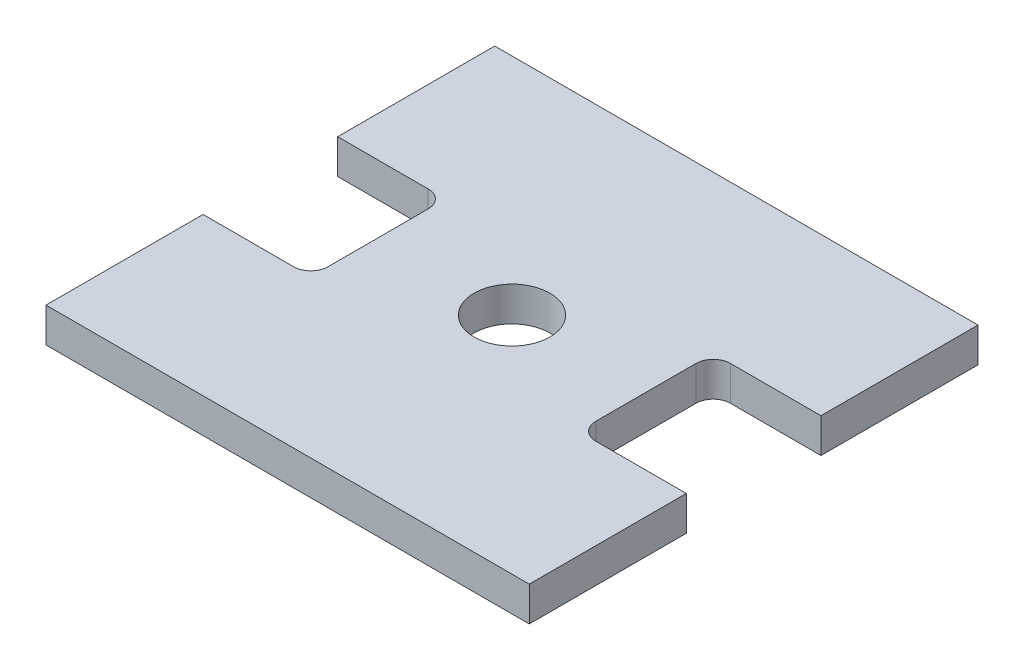
ISO-10303-21;
HEADER;
FILE_DESCRIPTION(('STEP AP214'),'2;1');
FILE_NAME('part.step','',(''),(''),'','','');
FILE_SCHEMA(('AUTOMOTIVE_DESIGN { 1 0 10303 214 1 1 1 1 }'));
ENDSEC;
DATA;
#1=APPLICATION_CONTEXT('core data for automotive mechanical design processes');
#2=APPLICATION_PROTOCOL_DEFINITION('international standard','automotive_design',2000,#1);
#3=PRODUCT_CONTEXT('',#1,'mechanical');
#4=PRODUCT('Part','Part','',(#3));
#5=PRODUCT_RELATED_PRODUCT_CATEGORY('part','',(#4));
#6=PRODUCT_DEFINITION_FORMATION('','',#4);
#7=PRODUCT_DEFINITION_CONTEXT('part definition',#1,'design');
#8=PRODUCT_DEFINITION('design','',#6,#7);
#9=PRODUCT_DEFINITION_SHAPE('','',#8);
#10=(LENGTH_UNIT() NAMED_UNIT(*) SI_UNIT(.MILLI.,.METRE.));
#11=(NAMED_UNIT(*) PLANE_ANGLE_UNIT() SI_UNIT($,.RADIAN.));
#12=(NAMED_UNIT(*) SI_UNIT($,.STERADIAN.) SOLID_ANGLE_UNIT());
#13=UNCERTAINTY_MEASURE_WITH_UNIT(LENGTH_MEASURE(1.E-05),#10,'distance_accuracy_value','');
#14=(GEOMETRIC_REPRESENTATION_CONTEXT(3) GLOBAL_UNCERTAINTY_ASSIGNED_CONTEXT((#13)) GLOBAL_UNIT_ASSIGNED_CONTEXT((#10,
#11,#12)) REPRESENTATION_CONTEXT('',''));
#15=CARTESIAN_POINT('',(0.,0.,0.));
#16=DIRECTION('',(0.,0.,1.));
#17=DIRECTION('',(1.,0.,0.));
#18=AXIS2_PLACEMENT_3D('',#15,#16,#17);
#19=CARTESIAN_POINT('',(-7.95386724772259,10.,2.43785422568007));
#20=DIRECTION('',(0.,1.,0.));
#21=DIRECTION('',(0.,0.,1.));
#22=AXIS2_PLACEMENT_3D('',#19,#20,#21);
#23=PLANE('',#22);
#24=DIRECTION('',(0.,0.,1.));
#25=VECTOR('',#24,1.);
#26=CARTESIAN_POINT('',(-34.1762724658674,10.,-48.0573759783204));
#27=LINE('',#26,#25);
#28=CARTESIAN_POINT('',(-34.1762724658674,10.,-48.0573759783204));
#29=VERTEX_POINT('',#28);
#30=CARTESIAN_POINT('',(-34.1762724658674,10.,-2.56214577431994));
#31=VERTEX_POINT('',#30);
#32=EDGE_CURVE('E208',#29,#31,#27,.T.);
#33=ORIENTED_EDGE('',*,*,#32,.T.);
#34=DIRECTION('',(1.,0.,0.));
#35=VECTOR('',#34,1.);
#36=CARTESIAN_POINT('',(-34.1762724658674,10.,-2.56214577431994));
#37=LINE('',#36,#35);
#38=CARTESIAN_POINT('',(-7.95386724772259,10.,-2.56214577431993));
#39=VERTEX_POINT('',#38);
#40=EDGE_CURVE('E116',#31,#39,#37,.T.);
#41=ORIENTED_EDGE('',*,*,#40,.T.);
#42=CARTESIAN_POINT('',(-7.95386724772259,10.,2.43785422568007));
#43=DIRECTION('',(0.,-1.,0.));
#44=DIRECTION('',(0.,0.,1.));
#45=AXIS2_PLACEMENT_3D('',#42,#43,#44);
#46=CIRCLE('',#45,5.);
#47=CARTESIAN_POINT('',(-2.95386724772259,10.,2.43785422568007));
#48=VERTEX_POINT('',#47);
#49=EDGE_CURVE('E247',#39,#48,#46,.T.);
#50=ORIENTED_EDGE('',*,*,#49,.T.);
#51=DIRECTION('',(0.,0.,1.));
#52=VECTOR('',#51,1.);
#53=CARTESIAN_POINT('',(-2.95386724772259,10.,2.43785422568007));
#54=LINE('',#53,#52);
#55=CARTESIAN_POINT('',(-2.95386724772259,10.,31.4473938176792));
#56=VERTEX_POINT('',#55);
#57=EDGE_CURVE('E266',#48,#56,#54,.T.);
#58=ORIENTED_EDGE('',*,*,#57,.T.);
#59=CARTESIAN_POINT('',(-7.95386724772259,10.,31.4473938176792));
#60=DIRECTION('',(0.,-1.,0.));
#61=DIRECTION('',(0.,0.,1.));
#62=AXIS2_PLACEMENT_3D('',#59,#60,#61);
#63=CIRCLE('',#62,5.);
#64=CARTESIAN_POINT('',(-7.95386724772259,10.,36.4473938176792));
#65=VERTEX_POINT('',#64);
#66=EDGE_CURVE('E263',#56,#65,#63,.T.);
#67=ORIENTED_EDGE('',*,*,#66,.T.);
#68=DIRECTION('',(-1.,0.,0.));
#69=VECTOR('',#68,1.);
#70=CARTESIAN_POINT('',(-34.1762724658674,10.,36.4473938176792));
#71=LINE('',#70,#69);
#72=CARTESIAN_POINT('',(-34.1762724658674,10.,36.4473938176792));
#73=VERTEX_POINT('',#72);
#74=EDGE_CURVE('E265',#65,#73,#71,.T.);
#75=ORIENTED_EDGE('',*,*,#74,.T.);
#76=DIRECTION('',(0.,0.,1.));
#77=VECTOR('',#76,1.);
#78=CARTESIAN_POINT('',(-34.1762724658674,10.,36.4473938176792));
#79=LINE('',#78,#77);
#80=CARTESIAN_POINT('',(-34.1762724658675,10.,81.9426240216796));
#81=VERTEX_POINT('',#80);
#82=EDGE_CURVE('E268',#73,#81,#79,.T.);
#83=ORIENTED_EDGE('',*,*,#82,.T.);
#84=DIRECTION('',(1.,0.,0.));
#85=VECTOR('',#84,1.);
#86=CARTESIAN_POINT('',(-34.1762724658675,10.,81.9426240216796));
#87=LINE('',#86,#85);
#88=CARTESIAN_POINT('',(105.823727534133,10.,81.9426240216796));
#89=VERTEX_POINT('',#88);
#90=EDGE_CURVE('E274',#81,#89,#87,.T.);
#91=ORIENTED_EDGE('',*,*,#90,.T.);
#92=DIRECTION('',(0.,0.,-1.));
#93=VECTOR('',#92,1.);
#94=CARTESIAN_POINT('',(105.823727534133,10.,36.4473938176792));
#95=LINE('',#94,#93);
#96=CARTESIAN_POINT('',(105.823727534133,10.,36.4473938176792));
#97=VERTEX_POINT('',#96);
#98=EDGE_CURVE('E276',#89,#97,#95,.T.);
#99=ORIENTED_EDGE('',*,*,#98,.T.);
#100=DIRECTION('',(-1.,0.,0.));
#101=VECTOR('',#100,1.);
#102=CARTESIAN_POINT('',(105.823727534133,10.,36.4473938176792));
#103=LINE('',#102,#101);
#104=CARTESIAN_POINT('',(79.6013223159877,10.,36.4473938176792));
#105=VERTEX_POINT('',#104);
#106=EDGE_CURVE('E278',#97,#105,#103,.T.);
#107=ORIENTED_EDGE('',*,*,#106,.T.);
#108=CARTESIAN_POINT('',(79.6013223159877,10.,31.4473938176792));
#109=DIRECTION('',(0.,-1.,0.));
#110=DIRECTION('',(0.,0.,-1.));
#111=AXIS2_PLACEMENT_3D('',#108,#109,#110);
#112=CIRCLE('',#111,5.);
#113=CARTESIAN_POINT('',(74.6013223159877,10.,31.4473938176792));
#114=VERTEX_POINT('',#113);
#115=EDGE_CURVE('E280',#105,#114,#112,.T.);
#116=ORIENTED_EDGE('',*,*,#115,.T.);
#117=DIRECTION('',(0.,0.,-1.));
#118=VECTOR('',#117,1.);
#119=CARTESIAN_POINT('',(74.6013223159877,10.,2.43785422568007));
#120=LINE('',#119,#118);
#121=CARTESIAN_POINT('',(74.6013223159877,10.,2.43785422568007));
#122=VERTEX_POINT('',#121);
#123=EDGE_CURVE('E282',#114,#122,#120,.T.);
#124=ORIENTED_EDGE('',*,*,#123,.T.);
#125=CARTESIAN_POINT('',(79.6013223159877,10.,2.43785422568007));
#126=DIRECTION('',(0.,-1.,0.));
#127=DIRECTION('',(0.,0.,-1.));
#128=AXIS2_PLACEMENT_3D('',#125,#126,#127);
#129=CIRCLE('',#128,5.);
#130=CARTESIAN_POINT('',(79.6013223159877,10.,-2.56214577431993));
#131=VERTEX_POINT('',#130);
#132=EDGE_CURVE('E159',#122,#131,#129,.T.);
#133=ORIENTED_EDGE('',*,*,#132,.T.);
#134=DIRECTION('',(1.,0.,0.));
#135=VECTOR('',#134,1.);
#136=CARTESIAN_POINT('',(105.823727534133,10.,-2.56214577431994));
#137=LINE('',#136,#135);
#138=CARTESIAN_POINT('',(105.823727534133,10.,-2.56214577431994));
#139=VERTEX_POINT('',#138);
#140=EDGE_CURVE('E153',#131,#139,#137,.T.);
#141=ORIENTED_EDGE('',*,*,#140,.T.);
#142=DIRECTION('',(0.,0.,-1.));
#143=VECTOR('',#142,1.);
#144=CARTESIAN_POINT('',(105.823727534133,10.,-48.0573759783204));
#145=LINE('',#144,#143);
#146=CARTESIAN_POINT('',(105.823727534133,10.,-48.0573759783204));
#147=VERTEX_POINT('',#146);
#148=EDGE_CURVE('E157',#139,#147,#145,.T.);
#149=ORIENTED_EDGE('',*,*,#148,.T.);
#150=DIRECTION('',(-1.,0.,0.));
#151=VECTOR('',#150,1.);
#152=CARTESIAN_POINT('',(-34.1762724658674,10.,-48.0573759783204));
#153=LINE('',#152,#151);
#154=EDGE_CURVE('E49',#147,#29,#153,.T.);
#155=ORIENTED_EDGE('',*,*,#154,.T.);
#156=EDGE_LOOP('',(#33,#41,#50,#58,#67,#75,#83,#91,#99,#107,#116,#124,#133,#141,#149,#155));
#157=FACE_BOUND('',#156,.T.);
#158=CARTESIAN_POINT('',(35.8237275341326,10.,16.9426240216796));
#159=DIRECTION('',(0.,1.,0.));
#160=DIRECTION('',(0.,0.,1.));
#161=AXIS2_PLACEMENT_3D('',#158,#159,#160);
#162=CIRCLE('',#161,11.);
#163=CARTESIAN_POINT('',(35.8237275341326,10.,27.9426240216796));
#164=VERTEX_POINT('',#163);
#165=EDGE_CURVE('E181',#164,#164,#162,.T.);
#166=ORIENTED_EDGE('',*,*,#165,.F.);
#167=EDGE_LOOP('',(#166));
#168=FACE_BOUND('',#167,.T.);
#169=ADVANCED_FACE('F32',(#157,#168),#23,.T.);
#170=CARTESIAN_POINT('',(-7.95386724772259,0.,2.43785422568007));
#171=DIRECTION('',(0.,1.,0.));
#172=DIRECTION('',(0.,0.,1.));
#173=AXIS2_PLACEMENT_3D('',#170,#171,#172);
#174=PLANE('',#173);
#175=DIRECTION('',(0.,0.,1.));
#176=VECTOR('',#175,1.);
#177=CARTESIAN_POINT('',(-34.1762724658674,0.,-48.0573759783204));
#178=LINE('',#177,#176);
#179=CARTESIAN_POINT('',(-34.1762724658674,0.,-48.0573759783204));
#180=VERTEX_POINT('',#179);
#181=CARTESIAN_POINT('',(-34.1762724658674,0.,-2.56214577431994));
#182=VERTEX_POINT('',#181);
#183=EDGE_CURVE('E177',#180,#182,#178,.T.);
#184=ORIENTED_EDGE('',*,*,#183,.F.);
#185=DIRECTION('',(-1.,0.,0.));
#186=VECTOR('',#185,1.);
#187=CARTESIAN_POINT('',(-34.1762724658674,0.,-48.0573759783204));
#188=LINE('',#187,#186);
#189=CARTESIAN_POINT('',(105.823727534133,0.,-48.0573759783204));
#190=VERTEX_POINT('',#189);
#191=EDGE_CURVE('E108',#190,#180,#188,.T.);
#192=ORIENTED_EDGE('',*,*,#191,.F.);
#193=DIRECTION('',(0.,0.,-1.));
#194=VECTOR('',#193,1.);
#195=CARTESIAN_POINT('',(105.823727534133,0.,-48.0573759783204));
#196=LINE('',#195,#194);
#197=CARTESIAN_POINT('',(105.823727534133,0.,-2.56214577431994));
#198=VERTEX_POINT('',#197);
#199=EDGE_CURVE('E102',#198,#190,#196,.T.);
#200=ORIENTED_EDGE('',*,*,#199,.F.);
#201=DIRECTION('',(1.,0.,0.));
#202=VECTOR('',#201,1.);
#203=CARTESIAN_POINT('',(105.823727534133,0.,-2.56214577431994));
#204=LINE('',#203,#202);
#205=CARTESIAN_POINT('',(79.6013223159877,0.,-2.56214577431993));
#206=VERTEX_POINT('',#205);
#207=EDGE_CURVE('E167',#206,#198,#204,.T.);
#208=ORIENTED_EDGE('',*,*,#207,.F.);
#209=CARTESIAN_POINT('',(79.6013223159877,0.,2.43785422568007));
#210=DIRECTION('',(0.,-1.,0.));
#211=DIRECTION('',(0.,0.,-1.));
#212=AXIS2_PLACEMENT_3D('',#209,#210,#211);
#213=CIRCLE('',#212,5.);
#214=CARTESIAN_POINT('',(74.6013223159877,0.,2.43785422568007));
#215=VERTEX_POINT('',#214);
#216=EDGE_CURVE('E203',#215,#206,#213,.T.);
#217=ORIENTED_EDGE('',*,*,#216,.F.);
#218=DIRECTION('',(0.,0.,-1.));
#219=VECTOR('',#218,1.);
#220=CARTESIAN_POINT('',(74.6013223159877,0.,2.43785422568007));
#221=LINE('',#220,#219);
#222=CARTESIAN_POINT('',(74.6013223159877,0.,31.4473938176792));
#223=VERTEX_POINT('',#222);
#224=EDGE_CURVE('E201',#223,#215,#221,.T.);
#225=ORIENTED_EDGE('',*,*,#224,.F.);
#226=CARTESIAN_POINT('',(79.6013223159877,0.,31.4473938176792));
#227=DIRECTION('',(0.,-1.,0.));
#228=DIRECTION('',(0.,0.,-1.));
#229=AXIS2_PLACEMENT_3D('',#226,#227,#228);
#230=CIRCLE('',#229,5.);
#231=CARTESIAN_POINT('',(79.6013223159877,0.,36.4473938176792));
#232=VERTEX_POINT('',#231);
#233=EDGE_CURVE('E199',#232,#223,#230,.T.);
#234=ORIENTED_EDGE('',*,*,#233,.F.);
#235=DIRECTION('',(-1.,0.,0.));
#236=VECTOR('',#235,1.);
#237=CARTESIAN_POINT('',(105.823727534133,0.,36.4473938176792));
#238=LINE('',#237,#236);
#239=CARTESIAN_POINT('',(105.823727534133,0.,36.4473938176792));
#240=VERTEX_POINT('',#239);
#241=EDGE_CURVE('E197',#240,#232,#238,.T.);
#242=ORIENTED_EDGE('',*,*,#241,.F.);
#243=DIRECTION('',(0.,0.,-1.));
#244=VECTOR('',#243,1.);
#245=CARTESIAN_POINT('',(105.823727534133,0.,36.4473938176792));
#246=LINE('',#245,#244);
#247=CARTESIAN_POINT('',(105.823727534133,0.,81.9426240216796));
#248=VERTEX_POINT('',#247);
#249=EDGE_CURVE('E195',#248,#240,#246,.T.);
#250=ORIENTED_EDGE('',*,*,#249,.F.);
#251=DIRECTION('',(1.,0.,0.));
#252=VECTOR('',#251,1.);
#253=CARTESIAN_POINT('',(-34.1762724658675,0.,81.9426240216796));
#254=LINE('',#253,#252);
#255=CARTESIAN_POINT('',(-34.1762724658675,0.,81.9426240216796));
#256=VERTEX_POINT('',#255);
#257=EDGE_CURVE('E193',#256,#248,#254,.T.);
#258=ORIENTED_EDGE('',*,*,#257,.F.);
#259=DIRECTION('',(0.,0.,1.));
#260=VECTOR('',#259,1.);
#261=CARTESIAN_POINT('',(-34.1762724658674,0.,36.4473938176792));
#262=LINE('',#261,#260);
#263=CARTESIAN_POINT('',(-34.1762724658674,0.,36.4473938176792));
#264=VERTEX_POINT('',#263);
#265=EDGE_CURVE('E191',#264,#256,#262,.T.);
#266=ORIENTED_EDGE('',*,*,#265,.F.);
#267=DIRECTION('',(-1.,0.,0.));
#268=VECTOR('',#267,1.);
#269=CARTESIAN_POINT('',(-34.1762724658674,0.,36.4473938176792));
#270=LINE('',#269,#268);
#271=CARTESIAN_POINT('',(-7.95386724772259,0.,36.4473938176792));
#272=VERTEX_POINT('',#271);
#273=EDGE_CURVE('E189',#272,#264,#270,.T.);
#274=ORIENTED_EDGE('',*,*,#273,.F.);
#275=CARTESIAN_POINT('',(-7.95386724772259,0.,31.4473938176792));
#276=DIRECTION('',(0.,-1.,0.));
#277=DIRECTION('',(0.,0.,1.));
#278=AXIS2_PLACEMENT_3D('',#275,#276,#277);
#279=CIRCLE('',#278,5.);
#280=CARTESIAN_POINT('',(-2.95386724772259,0.,31.4473938176792));
#281=VERTEX_POINT('',#280);
#282=EDGE_CURVE('E187',#281,#272,#279,.T.);
#283=ORIENTED_EDGE('',*,*,#282,.F.);
#284=DIRECTION('',(0.,0.,1.));
#285=VECTOR('',#284,1.);
#286=CARTESIAN_POINT('',(-2.95386724772259,0.,2.43785422568007));
#287=LINE('',#286,#285);
#288=CARTESIAN_POINT('',(-2.95386724772259,0.,2.43785422568007));
#289=VERTEX_POINT('',#288);
#290=EDGE_CURVE('E185',#289,#281,#287,.T.);
#291=ORIENTED_EDGE('',*,*,#290,.F.);
#292=CARTESIAN_POINT('',(-7.95386724772259,0.,2.43785422568007));
#293=DIRECTION('',(0.,-1.,0.));
#294=DIRECTION('',(0.,0.,1.));
#295=AXIS2_PLACEMENT_3D('',#292,#293,#294);
#296=CIRCLE('',#295,5.);
#297=CARTESIAN_POINT('',(-7.95386724772259,0.,-2.56214577431993));
#298=VERTEX_POINT('',#297);
#299=EDGE_CURVE('E183',#298,#289,#296,.T.);
#300=ORIENTED_EDGE('',*,*,#299,.F.);
#301=DIRECTION('',(1.,0.,0.));
#302=VECTOR('',#301,1.);
#303=CARTESIAN_POINT('',(-34.1762724658674,0.,-2.56214577431994));
#304=LINE('',#303,#302);
#305=EDGE_CURVE('E180',#182,#298,#304,.T.);
#306=ORIENTED_EDGE('',*,*,#305,.F.);
#307=EDGE_LOOP('',(#184,#192,#200,#208,#217,#225,#234,#242,#250,#258,#266,#274,#283,#291,#300,#306));
#308=FACE_BOUND('',#307,.T.);
#309=CARTESIAN_POINT('',(35.8237275341326,0.,16.9426240216796));
#310=DIRECTION('',(0.,1.,0.));
#311=DIRECTION('',(0.,0.,1.));
#312=AXIS2_PLACEMENT_3D('',#309,#310,#311);
#313=CIRCLE('',#312,11.);
#314=CARTESIAN_POINT('',(35.8237275341326,0.,27.9426240216796));
#315=VERTEX_POINT('',#314);
#316=EDGE_CURVE('E481',#315,#315,#313,.T.);
#317=ORIENTED_EDGE('',*,*,#316,.T.);
#318=EDGE_LOOP('',(#317));
#319=FACE_BOUND('',#318,.T.);
#320=ADVANCED_FACE('F251',(#308,#319),#174,.F.);
#321=CARTESIAN_POINT('',(-34.1762724658674,10.,-48.0573759783204));
#322=DIRECTION('',(1.,0.,0.));
#323=DIRECTION('',(0.,0.,-1.));
#324=AXIS2_PLACEMENT_3D('',#321,#322,#323);
#325=PLANE('',#324);
#326=ORIENTED_EDGE('',*,*,#183,.T.);
#327=DIRECTION('',(0.,-1.,0.));
#328=VECTOR('',#327,1.);
#329=CARTESIAN_POINT('',(-34.1762724658674,10.,-2.56214577431994));
#330=LINE('',#329,#328);
#331=EDGE_CURVE('E11',#31,#182,#330,.T.);
#332=ORIENTED_EDGE('',*,*,#331,.F.);
#333=ORIENTED_EDGE('',*,*,#32,.F.);
#334=DIRECTION('',(0.,-1.,0.));
#335=VECTOR('',#334,1.);
#336=CARTESIAN_POINT('',(-34.1762724658674,10.,-48.0573759783204));
#337=LINE('',#336,#335);
#338=EDGE_CURVE('E173',#29,#180,#337,.T.);
#339=ORIENTED_EDGE('',*,*,#338,.T.);
#340=EDGE_LOOP('',(#326,#332,#333,#339));
#341=FACE_BOUND('',#340,.T.);
#342=ADVANCED_FACE('F34',(#341),#325,.F.);
#343=CARTESIAN_POINT('',(-34.1762724658674,10.,-2.56214577431994));
#344=DIRECTION('',(0.,0.,-1.));
#345=DIRECTION('',(-1.,0.,0.));
#346=AXIS2_PLACEMENT_3D('',#343,#344,#345);
#347=PLANE('',#346);
#348=ORIENTED_EDGE('',*,*,#305,.T.);
#349=DIRECTION('',(0.,-1.,0.));
#350=VECTOR('',#349,1.);
#351=CARTESIAN_POINT('',(-7.95386724772259,10.,-2.56214577431993));
#352=LINE('',#351,#350);
#353=EDGE_CURVE('E41',#39,#298,#352,.T.);
#354=ORIENTED_EDGE('',*,*,#353,.F.);
#355=ORIENTED_EDGE('',*,*,#40,.F.);
#356=ORIENTED_EDGE('',*,*,#331,.T.);
#357=EDGE_LOOP('',(#348,#354,#355,#356));
#358=FACE_BOUND('',#357,.T.);
#359=ADVANCED_FACE('F316',(#358),#347,.F.);
#360=CARTESIAN_POINT('',(-7.95386724772259,10.,2.43785422568007));
#361=DIRECTION('',(0.,-1.,0.));
#362=DIRECTION('',(0.,0.,-1.));
#363=AXIS2_PLACEMENT_3D('',#360,#361,#362);
#364=CYLINDRICAL_SURFACE('',#363,5.);
#365=ORIENTED_EDGE('',*,*,#299,.T.);
#366=DIRECTION('',(0.,-1.,0.));
#367=VECTOR('',#366,1.);
#368=CARTESIAN_POINT('',(-2.95386724772259,10.,2.43785422568007));
#369=LINE('',#368,#367);
#370=EDGE_CURVE('E239',#48,#289,#369,.T.);
#371=ORIENTED_EDGE('',*,*,#370,.F.);
#372=ORIENTED_EDGE('',*,*,#49,.F.);
#373=ORIENTED_EDGE('',*,*,#353,.T.);
#374=EDGE_LOOP('',(#365,#371,#372,#373));
#375=FACE_BOUND('',#374,.T.);
#376=ADVANCED_FACE('F245',(#375),#364,.F.);
#377=CARTESIAN_POINT('',(-2.95386724772259,10.,2.43785422568007));
#378=DIRECTION('',(1.,0.,0.));
#379=DIRECTION('',(0.,0.,-1.));
#380=AXIS2_PLACEMENT_3D('',#377,#378,#379);
#381=PLANE('',#380);
#382=ORIENTED_EDGE('',*,*,#290,.T.);
#383=DIRECTION('',(0.,-1.,0.));
#384=VECTOR('',#383,1.);
#385=CARTESIAN_POINT('',(-2.95386724772259,10.,31.4473938176792));
#386=LINE('',#385,#384);
#387=EDGE_CURVE('E236',#56,#281,#386,.T.);
#388=ORIENTED_EDGE('',*,*,#387,.F.);
#389=ORIENTED_EDGE('',*,*,#57,.F.);
#390=ORIENTED_EDGE('',*,*,#370,.T.);
#391=EDGE_LOOP('',(#382,#388,#389,#390));
#392=FACE_BOUND('',#391,.T.);
#393=ADVANCED_FACE('F257',(#392),#381,.F.);
#394=CARTESIAN_POINT('',(-7.95386724772259,10.,31.4473938176792));
#395=DIRECTION('',(0.,-1.,0.));
#396=DIRECTION('',(0.,0.,-1.));
#397=AXIS2_PLACEMENT_3D('',#394,#395,#396);
#398=CYLINDRICAL_SURFACE('',#397,5.);
#399=ORIENTED_EDGE('',*,*,#282,.T.);
#400=DIRECTION('',(0.,-1.,0.));
#401=VECTOR('',#400,1.);
#402=CARTESIAN_POINT('',(-7.95386724772259,10.,36.4473938176792));
#403=LINE('',#402,#401);
#404=EDGE_CURVE('E233',#65,#272,#403,.T.);
#405=ORIENTED_EDGE('',*,*,#404,.F.);
#406=ORIENTED_EDGE('',*,*,#66,.F.);
#407=ORIENTED_EDGE('',*,*,#387,.T.);
#408=EDGE_LOOP('',(#399,#405,#406,#407));
#409=FACE_BOUND('',#408,.T.);
#410=ADVANCED_FACE('F261',(#409),#398,.F.);
#411=CARTESIAN_POINT('',(-34.1762724658674,10.,36.4473938176792));
#412=DIRECTION('',(0.,0.,1.));
#413=DIRECTION('',(1.,0.,0.));
#414=AXIS2_PLACEMENT_3D('',#411,#412,#413);
#415=PLANE('',#414);
#416=ORIENTED_EDGE('',*,*,#273,.T.);
#417=DIRECTION('',(0.,-1.,0.));
#418=VECTOR('',#417,1.);
#419=CARTESIAN_POINT('',(-34.1762724658674,10.,36.4473938176792));
#420=LINE('',#419,#418);
#421=EDGE_CURVE('E230',#73,#264,#420,.T.);
#422=ORIENTED_EDGE('',*,*,#421,.F.);
#423=ORIENTED_EDGE('',*,*,#74,.F.);
#424=ORIENTED_EDGE('',*,*,#404,.T.);
#425=EDGE_LOOP('',(#416,#422,#423,#424));
#426=FACE_BOUND('',#425,.T.);
#427=ADVANCED_FACE('F329',(#426),#415,.F.);
#428=CARTESIAN_POINT('',(-34.1762724658674,10.,36.4473938176792));
#429=DIRECTION('',(1.,0.,0.));
#430=DIRECTION('',(0.,0.,-1.));
#431=AXIS2_PLACEMENT_3D('',#428,#429,#430);
#432=PLANE('',#431);
#433=ORIENTED_EDGE('',*,*,#265,.T.);
#434=DIRECTION('',(0.,-1.,0.));
#435=VECTOR('',#434,1.);
#436=CARTESIAN_POINT('',(-34.1762724658675,10.,81.9426240216796));
#437=LINE('',#436,#435);
#438=EDGE_CURVE('E227',#81,#256,#437,.T.);
#439=ORIENTED_EDGE('',*,*,#438,.F.);
#440=ORIENTED_EDGE('',*,*,#82,.F.);
#441=ORIENTED_EDGE('',*,*,#421,.T.);
#442=EDGE_LOOP('',(#433,#439,#440,#441));
#443=FACE_BOUND('',#442,.T.);
#444=ADVANCED_FACE('F332',(#443),#432,.F.);
#445=CARTESIAN_POINT('',(-34.1762724658675,10.,81.9426240216796));
#446=DIRECTION('',(0.,0.,-1.));
#447=DIRECTION('',(-1.,0.,0.));
#448=AXIS2_PLACEMENT_3D('',#445,#446,#447);
#449=PLANE('',#448);
#450=ORIENTED_EDGE('',*,*,#257,.T.);
#451=DIRECTION('',(0.,-1.,0.));
#452=VECTOR('',#451,1.);
#453=CARTESIAN_POINT('',(105.823727534133,10.,81.9426240216796));
#454=LINE('',#453,#452);
#455=EDGE_CURVE('E224',#89,#248,#454,.T.);
#456=ORIENTED_EDGE('',*,*,#455,.F.);
#457=ORIENTED_EDGE('',*,*,#90,.F.);
#458=ORIENTED_EDGE('',*,*,#438,.T.);
#459=EDGE_LOOP('',(#450,#456,#457,#458));
#460=FACE_BOUND('',#459,.T.);
#461=ADVANCED_FACE('F336',(#460),#449,.F.);
#462=CARTESIAN_POINT('',(105.823727534133,10.,36.4473938176792));
#463=DIRECTION('',(-1.,0.,0.));
#464=DIRECTION('',(0.,0.,1.));
#465=AXIS2_PLACEMENT_3D('',#462,#463,#464);
#466=PLANE('',#465);
#467=ORIENTED_EDGE('',*,*,#249,.T.);
#468=DIRECTION('',(0.,-1.,0.));
#469=VECTOR('',#468,1.);
#470=CARTESIAN_POINT('',(105.823727534133,10.,36.4473938176792));
#471=LINE('',#470,#469);
#472=EDGE_CURVE('E221',#97,#240,#471,.T.);
#473=ORIENTED_EDGE('',*,*,#472,.F.);
#474=ORIENTED_EDGE('',*,*,#98,.F.);
#475=ORIENTED_EDGE('',*,*,#455,.T.);
#476=EDGE_LOOP('',(#467,#473,#474,#475));
#477=FACE_BOUND('',#476,.T.);
#478=ADVANCED_FACE('F340',(#477),#466,.F.);
#479=CARTESIAN_POINT('',(105.823727534133,10.,36.4473938176792));
#480=DIRECTION('',(0.,0.,1.));
#481=DIRECTION('',(1.,0.,0.));
#482=AXIS2_PLACEMENT_3D('',#479,#480,#481);
#483=PLANE('',#482);
#484=ORIENTED_EDGE('',*,*,#241,.T.);
#485=DIRECTION('',(0.,-1.,0.));
#486=VECTOR('',#485,1.);
#487=CARTESIAN_POINT('',(79.6013223159877,10.,36.4473938176792));
#488=LINE('',#487,#486);
#489=EDGE_CURVE('E218',#105,#232,#488,.T.);
#490=ORIENTED_EDGE('',*,*,#489,.F.);
#491=ORIENTED_EDGE('',*,*,#106,.F.);
#492=ORIENTED_EDGE('',*,*,#472,.T.);
#493=EDGE_LOOP('',(#484,#490,#491,#492));
#494=FACE_BOUND('',#493,.T.);
#495=ADVANCED_FACE('F344',(#494),#483,.F.);
#496=CARTESIAN_POINT('',(79.6013223159877,10.,31.4473938176792));
#497=DIRECTION('',(0.,-1.,0.));
#498=DIRECTION('',(0.,0.,-1.));
#499=AXIS2_PLACEMENT_3D('',#496,#497,#498);
#500=CYLINDRICAL_SURFACE('',#499,5.);
#501=ORIENTED_EDGE('',*,*,#233,.T.);
#502=DIRECTION('',(0.,-1.,0.));
#503=VECTOR('',#502,1.);
#504=CARTESIAN_POINT('',(74.6013223159877,10.,31.4473938176792));
#505=LINE('',#504,#503);
#506=EDGE_CURVE('E215',#114,#223,#505,.T.);
#507=ORIENTED_EDGE('',*,*,#506,.F.);
#508=ORIENTED_EDGE('',*,*,#115,.F.);
#509=ORIENTED_EDGE('',*,*,#489,.T.);
#510=EDGE_LOOP('',(#501,#507,#508,#509));
#511=FACE_BOUND('',#510,.T.);
#512=ADVANCED_FACE('F348',(#511),#500,.F.);
#513=CARTESIAN_POINT('',(74.6013223159877,10.,2.43785422568007));
#514=DIRECTION('',(-1.,0.,0.));
#515=DIRECTION('',(0.,0.,1.));
#516=AXIS2_PLACEMENT_3D('',#513,#514,#515);
#517=PLANE('',#516);
#518=ORIENTED_EDGE('',*,*,#224,.T.);
#519=DIRECTION('',(0.,-1.,0.));
#520=VECTOR('',#519,1.);
#521=CARTESIAN_POINT('',(74.6013223159877,10.,2.43785422568007));
#522=LINE('',#521,#520);
#523=EDGE_CURVE('E212',#122,#215,#522,.T.);
#524=ORIENTED_EDGE('',*,*,#523,.F.);
#525=ORIENTED_EDGE('',*,*,#123,.F.);
#526=ORIENTED_EDGE('',*,*,#506,.T.);
#527=EDGE_LOOP('',(#518,#524,#525,#526));
#528=FACE_BOUND('',#527,.T.);
#529=ADVANCED_FACE('F288',(#528),#517,.F.);
#530=CARTESIAN_POINT('',(79.6013223159877,10.,2.43785422568007));
#531=DIRECTION('',(0.,-1.,0.));
#532=DIRECTION('',(0.,0.,-1.));
#533=AXIS2_PLACEMENT_3D('',#530,#531,#532);
#534=CYLINDRICAL_SURFACE('',#533,5.);
#535=ORIENTED_EDGE('',*,*,#216,.T.);
#536=DIRECTION('',(0.,-1.,0.));
#537=VECTOR('',#536,1.);
#538=CARTESIAN_POINT('',(79.6013223159877,10.,-2.56214577431993));
#539=LINE('',#538,#537);
#540=EDGE_CURVE('E168',#131,#206,#539,.T.);
#541=ORIENTED_EDGE('',*,*,#540,.F.);
#542=ORIENTED_EDGE('',*,*,#132,.F.);
#543=ORIENTED_EDGE('',*,*,#523,.T.);
#544=EDGE_LOOP('',(#535,#541,#542,#543));
#545=FACE_BOUND('',#544,.T.);
#546=ADVANCED_FACE('F292',(#545),#534,.F.);
#547=CARTESIAN_POINT('',(105.823727534133,10.,-2.56214577431994));
#548=DIRECTION('',(0.,0.,-1.));
#549=DIRECTION('',(-1.,0.,0.));
#550=AXIS2_PLACEMENT_3D('',#547,#548,#549);
#551=PLANE('',#550);
#552=ORIENTED_EDGE('',*,*,#207,.T.);
#553=DIRECTION('',(0.,-1.,0.));
#554=VECTOR('',#553,1.);
#555=CARTESIAN_POINT('',(105.823727534133,10.,-2.56214577431994));
#556=LINE('',#555,#554);
#557=EDGE_CURVE('E164',#139,#198,#556,.T.);
#558=ORIENTED_EDGE('',*,*,#557,.F.);
#559=ORIENTED_EDGE('',*,*,#140,.F.);
#560=ORIENTED_EDGE('',*,*,#540,.T.);
#561=EDGE_LOOP('',(#552,#558,#559,#560));
#562=FACE_BOUND('',#561,.T.);
#563=ADVANCED_FACE('F165',(#562),#551,.F.);
#564=CARTESIAN_POINT('',(105.823727534133,10.,-48.0573759783204));
#565=DIRECTION('',(-1.,0.,0.));
#566=DIRECTION('',(0.,0.,1.));
#567=AXIS2_PLACEMENT_3D('',#564,#565,#566);
#568=PLANE('',#567);
#569=ORIENTED_EDGE('',*,*,#199,.T.);
#570=DIRECTION('',(0.,-1.,0.));
#571=VECTOR('',#570,1.);
#572=CARTESIAN_POINT('',(105.823727534133,10.,-48.0573759783204));
#573=LINE('',#572,#571);
#574=EDGE_CURVE('E169',#147,#190,#573,.T.);
#575=ORIENTED_EDGE('',*,*,#574,.F.);
#576=ORIENTED_EDGE('',*,*,#148,.F.);
#577=ORIENTED_EDGE('',*,*,#557,.T.);
#578=EDGE_LOOP('',(#569,#575,#576,#577));
#579=FACE_BOUND('',#578,.T.);
#580=ADVANCED_FACE('F171',(#579),#568,.F.);
#581=CARTESIAN_POINT('',(-34.1762724658674,10.,-48.0573759783204));
#582=DIRECTION('',(0.,0.,1.));
#583=DIRECTION('',(1.,0.,0.));
#584=AXIS2_PLACEMENT_3D('',#581,#582,#583);
#585=PLANE('',#584);
#586=ORIENTED_EDGE('',*,*,#191,.T.);
#587=ORIENTED_EDGE('',*,*,#338,.F.);
#588=ORIENTED_EDGE('',*,*,#154,.F.);
#589=ORIENTED_EDGE('',*,*,#574,.T.);
#590=EDGE_LOOP('',(#586,#587,#588,#589));
#591=FACE_BOUND('',#590,.T.);
#592=ADVANCED_FACE('F296',(#591),#585,.F.);
#593=CARTESIAN_POINT('',(35.8237275341326,10.,16.9426240216796));
#594=DIRECTION('',(0.,-1.,0.));
#595=DIRECTION('',(0.,0.,-1.));
#596=AXIS2_PLACEMENT_3D('',#593,#594,#595);
#597=CYLINDRICAL_SURFACE('',#596,11.);
#598=ORIENTED_EDGE('',*,*,#165,.T.);
#599=EDGE_LOOP('',(#598));
#600=FACE_BOUND('',#599,.T.);
#601=ORIENTED_EDGE('',*,*,#316,.F.);
#602=EDGE_LOOP('',(#601));
#603=FACE_BOUND('',#602,.T.);
#604=ADVANCED_FACE('F298',(#600,#603),#597,.F.);
#605=CLOSED_SHELL('',(#169,#320,#342,#359,#376,#393,#410,#427,#444,#461,#478,#495,#512,#529,
#546,#563,#580,#592,#604));
#606=MANIFOLD_SOLID_BREP('B2',#605);
#607=ADVANCED_BREP_SHAPE_REPRESENTATION('',(#18,#606),#14);
#608=SHAPE_DEFINITION_REPRESENTATION(#9,#607);
ENDSEC;
END-ISO-10303-21;
